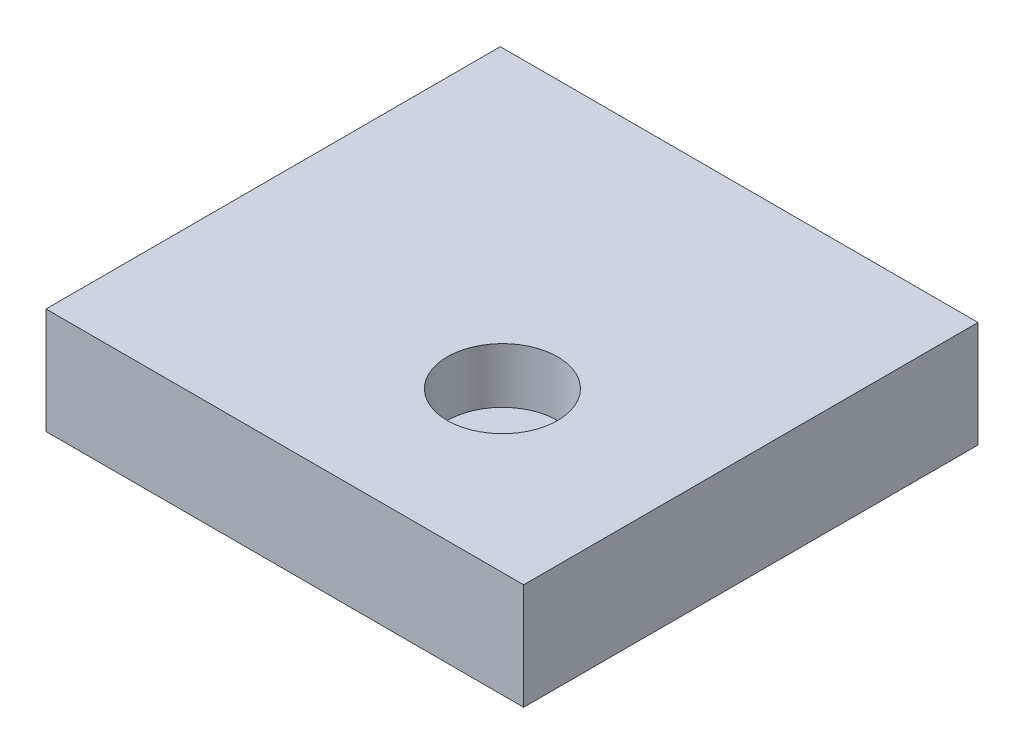
ISO-10303-21;
HEADER;
FILE_DESCRIPTION(('STEP AP214'),'2;1');
FILE_NAME('part.step','',(''),(''),'','','');
FILE_SCHEMA(('AUTOMOTIVE_DESIGN { 1 0 10303 214 1 1 1 1 }'));
ENDSEC;
DATA;
#1=APPLICATION_CONTEXT('core data for automotive mechanical design processes');
#2=APPLICATION_PROTOCOL_DEFINITION('international standard','automotive_design',2000,#1);
#3=PRODUCT_CONTEXT('',#1,'mechanical');
#4=PRODUCT('Part','Part','',(#3));
#5=PRODUCT_RELATED_PRODUCT_CATEGORY('part','',(#4));
#6=PRODUCT_DEFINITION_FORMATION('','',#4);
#7=PRODUCT_DEFINITION_CONTEXT('part definition',#1,'design');
#8=PRODUCT_DEFINITION('design','',#6,#7);
#9=PRODUCT_DEFINITION_SHAPE('','',#8);
#10=(LENGTH_UNIT() NAMED_UNIT(*) SI_UNIT(.MILLI.,.METRE.));
#11=(NAMED_UNIT(*) PLANE_ANGLE_UNIT() SI_UNIT($,.RADIAN.));
#12=(NAMED_UNIT(*) SI_UNIT($,.STERADIAN.) SOLID_ANGLE_UNIT());
#13=UNCERTAINTY_MEASURE_WITH_UNIT(LENGTH_MEASURE(1.E-05),#10,'distance_accuracy_value','');
#14=(GEOMETRIC_REPRESENTATION_CONTEXT(3) GLOBAL_UNCERTAINTY_ASSIGNED_CONTEXT((#13)) GLOBAL_UNIT_ASSIGNED_CONTEXT((#10,
#11,#12)) REPRESENTATION_CONTEXT('',''));
#15=CARTESIAN_POINT('',(0.,0.,0.));
#16=DIRECTION('',(0.,0.,1.));
#17=DIRECTION('',(1.,0.,0.));
#18=AXIS2_PLACEMENT_3D('',#15,#16,#17);
#19=CARTESIAN_POINT('',(-20.,5.,21.4));
#20=DIRECTION('',(0.,0.,-1.));
#21=DIRECTION('',(-1.,0.,0.));
#22=AXIS2_PLACEMENT_3D('',#19,#20,#21);
#23=PLANE('',#22);
#24=DIRECTION('',(1.,0.,0.));
#25=VECTOR('',#24,1.);
#26=CARTESIAN_POINT('',(-20.,0.,21.4));
#27=LINE('',#26,#25);
#28=CARTESIAN_POINT('',(-20.,0.,21.4));
#29=VERTEX_POINT('',#28);
#30=CARTESIAN_POINT('',(2.5,0.,21.4));
#31=VERTEX_POINT('',#30);
#32=EDGE_CURVE('E78',#29,#31,#27,.T.);
#33=ORIENTED_EDGE('',*,*,#32,.T.);
#34=DIRECTION('',(0.,-1.,0.));
#35=VECTOR('',#34,1.);
#36=CARTESIAN_POINT('',(2.5,0.,21.4));
#37=LINE('',#36,#35);
#38=CARTESIAN_POINT('',(2.5,5.,21.4));
#39=VERTEX_POINT('',#38);
#40=EDGE_CURVE('E81',#39,#31,#37,.T.);
#41=ORIENTED_EDGE('',*,*,#40,.F.);
#42=DIRECTION('',(1.,0.,0.));
#43=VECTOR('',#42,1.);
#44=CARTESIAN_POINT('',(-20.,5.,21.4));
#45=LINE('',#44,#43);
#46=CARTESIAN_POINT('',(-20.,5.,21.4));
#47=VERTEX_POINT('',#46);
#48=EDGE_CURVE('E65',#47,#39,#45,.T.);
#49=ORIENTED_EDGE('',*,*,#48,.F.);
#50=DIRECTION('',(0.,-1.,0.));
#51=VECTOR('',#50,1.);
#52=CARTESIAN_POINT('',(-20.,5.,21.4));
#53=LINE('',#52,#51);
#54=EDGE_CURVE('E45',#47,#29,#53,.T.);
#55=ORIENTED_EDGE('',*,*,#54,.T.);
#56=EDGE_LOOP('',(#33,#41,#49,#55));
#57=FACE_BOUND('',#56,.T.);
#58=ADVANCED_FACE('F37',(#57),#23,.F.);
#59=CARTESIAN_POINT('',(-20.,5.,0.));
#60=DIRECTION('',(0.,0.,-1.));
#61=DIRECTION('',(-1.,0.,0.));
#62=AXIS2_PLACEMENT_3D('',#59,#60,#61);
#63=PLANE('',#62);
#64=CARTESIAN_POINT('',(-5.,2.5,0.));
#65=DIRECTION('',(0.,0.,-1.));
#66=DIRECTION('',(-1.,0.,0.));
#67=AXIS2_PLACEMENT_3D('',#64,#65,#66);
#68=CIRCLE('',#67,0.85);
#69=CARTESIAN_POINT('',(-5.85,2.5,0.));
#70=VERTEX_POINT('',#69);
#71=EDGE_CURVE('E111',#70,#70,#68,.T.);
#72=ORIENTED_EDGE('',*,*,#71,.F.);
#73=EDGE_LOOP('',(#72));
#74=FACE_BOUND('',#73,.T.);
#75=CARTESIAN_POINT('',(-15.,2.5,0.));
#76=DIRECTION('',(0.,0.,-1.));
#77=DIRECTION('',(-1.,0.,0.));
#78=AXIS2_PLACEMENT_3D('',#75,#76,#77);
#79=CIRCLE('',#78,0.85);
#80=CARTESIAN_POINT('',(-15.85,2.5,0.));
#81=VERTEX_POINT('',#80);
#82=EDGE_CURVE('E114',#81,#81,#79,.T.);
#83=ORIENTED_EDGE('',*,*,#82,.F.);
#84=EDGE_LOOP('',(#83));
#85=FACE_BOUND('',#84,.T.);
#86=DIRECTION('',(1.,0.,0.));
#87=VECTOR('',#86,1.);
#88=CARTESIAN_POINT('',(-20.,0.,0.));
#89=LINE('',#88,#87);
#90=CARTESIAN_POINT('',(-20.,0.,0.));
#91=VERTEX_POINT('',#90);
#92=CARTESIAN_POINT('',(2.5,0.,0.));
#93=VERTEX_POINT('',#92);
#94=EDGE_CURVE('E84',#91,#93,#89,.T.);
#95=ORIENTED_EDGE('',*,*,#94,.F.);
#96=DIRECTION('',(0.,-1.,0.));
#97=VECTOR('',#96,1.);
#98=CARTESIAN_POINT('',(-20.,5.,0.));
#99=LINE('',#98,#97);
#100=CARTESIAN_POINT('',(-20.,5.,0.));
#101=VERTEX_POINT('',#100);
#102=EDGE_CURVE('E11',#101,#91,#99,.T.);
#103=ORIENTED_EDGE('',*,*,#102,.F.);
#104=DIRECTION('',(1.,0.,0.));
#105=VECTOR('',#104,1.);
#106=CARTESIAN_POINT('',(-20.,5.,0.));
#107=LINE('',#106,#105);
#108=CARTESIAN_POINT('',(2.5,5.,0.));
#109=VERTEX_POINT('',#108);
#110=EDGE_CURVE('E130',#101,#109,#107,.T.);
#111=ORIENTED_EDGE('',*,*,#110,.T.);
#112=DIRECTION('',(0.,1.,0.));
#113=VECTOR('',#112,1.);
#114=CARTESIAN_POINT('',(2.5,0.,0.));
#115=LINE('',#114,#113);
#116=EDGE_CURVE('E93',#93,#109,#115,.T.);
#117=ORIENTED_EDGE('',*,*,#116,.F.);
#118=EDGE_LOOP('',(#95,#103,#111,#117));
#119=FACE_BOUND('',#118,.T.);
#120=ADVANCED_FACE('F139',(#74,#85,#119),#63,.T.);
#121=CARTESIAN_POINT('',(-20.,5.,21.4));
#122=DIRECTION('',(-1.,0.,0.));
#123=DIRECTION('',(0.,0.,1.));
#124=AXIS2_PLACEMENT_3D('',#121,#122,#123);
#125=PLANE('',#124);
#126=CARTESIAN_POINT('',(-20.,2.5,16.4));
#127=DIRECTION('',(-1.,0.,0.));
#128=DIRECTION('',(0.,0.,1.));
#129=AXIS2_PLACEMENT_3D('',#126,#127,#128);
#130=CIRCLE('',#129,0.85);
#131=CARTESIAN_POINT('',(-20.,2.5,17.25));
#132=VERTEX_POINT('',#131);
#133=EDGE_CURVE('E121',#132,#132,#130,.T.);
#134=ORIENTED_EDGE('',*,*,#133,.F.);
#135=EDGE_LOOP('',(#134));
#136=FACE_BOUND('',#135,.T.);
#137=CARTESIAN_POINT('',(-20.,2.5,5.));
#138=DIRECTION('',(-1.,0.,0.));
#139=DIRECTION('',(0.,0.,1.));
#140=AXIS2_PLACEMENT_3D('',#137,#138,#139);
#141=CIRCLE('',#140,0.85);
#142=CARTESIAN_POINT('',(-20.,2.5,5.85));
#143=VERTEX_POINT('',#142);
#144=EDGE_CURVE('E124',#143,#143,#141,.T.);
#145=ORIENTED_EDGE('',*,*,#144,.F.);
#146=EDGE_LOOP('',(#145));
#147=FACE_BOUND('',#146,.T.);
#148=DIRECTION('',(0.,0.,-1.));
#149=VECTOR('',#148,1.);
#150=CARTESIAN_POINT('',(-20.,0.,21.4));
#151=LINE('',#150,#149);
#152=EDGE_CURVE('E131',#29,#91,#151,.T.);
#153=ORIENTED_EDGE('',*,*,#152,.F.);
#154=ORIENTED_EDGE('',*,*,#54,.F.);
#155=DIRECTION('',(0.,0.,-1.));
#156=VECTOR('',#155,1.);
#157=CARTESIAN_POINT('',(-20.,5.,21.4));
#158=LINE('',#157,#156);
#159=EDGE_CURVE('E133',#47,#101,#158,.T.);
#160=ORIENTED_EDGE('',*,*,#159,.T.);
#161=ORIENTED_EDGE('',*,*,#102,.T.);
#162=EDGE_LOOP('',(#153,#154,#160,#161));
#163=FACE_BOUND('',#162,.T.);
#164=ADVANCED_FACE('F136',(#136,#147,#163),#125,.T.);
#165=CARTESIAN_POINT('',(0.,5.,0.));
#166=DIRECTION('',(0.,1.,0.));
#167=DIRECTION('',(0.,0.,1.));
#168=AXIS2_PLACEMENT_3D('',#165,#166,#167);
#169=PLANE('',#168);
#170=CARTESIAN_POINT('',(-6.00000000000001,5.,13.9));
#171=DIRECTION('',(0.,1.,0.));
#172=DIRECTION('',(0.,0.,1.));
#173=AXIS2_PLACEMENT_3D('',#170,#171,#172);
#174=CIRCLE('',#173,2.6);
#175=CARTESIAN_POINT('',(-6.00000000000001,5.,16.5));
#176=VERTEX_POINT('',#175);
#177=EDGE_CURVE('E100',#176,#176,#174,.T.);
#178=ORIENTED_EDGE('',*,*,#177,.F.);
#179=EDGE_LOOP('',(#178));
#180=FACE_BOUND('',#179,.T.);
#181=ORIENTED_EDGE('',*,*,#48,.T.);
#182=DIRECTION('',(0.,0.,1.));
#183=VECTOR('',#182,1.);
#184=CARTESIAN_POINT('',(2.5,5.,21.4));
#185=LINE('',#184,#183);
#186=EDGE_CURVE('E96',#109,#39,#185,.T.);
#187=ORIENTED_EDGE('',*,*,#186,.F.);
#188=ORIENTED_EDGE('',*,*,#110,.F.);
#189=ORIENTED_EDGE('',*,*,#159,.F.);
#190=EDGE_LOOP('',(#181,#187,#188,#189));
#191=FACE_BOUND('',#190,.T.);
#192=ADVANCED_FACE('F138',(#180,#191),#169,.T.);
#193=CARTESIAN_POINT('',(0.,0.,0.));
#194=DIRECTION('',(0.,1.,0.));
#195=DIRECTION('',(0.,0.,1.));
#196=AXIS2_PLACEMENT_3D('',#193,#194,#195);
#197=PLANE('',#196);
#198=ORIENTED_EDGE('',*,*,#32,.F.);
#199=ORIENTED_EDGE('',*,*,#152,.T.);
#200=ORIENTED_EDGE('',*,*,#94,.T.);
#201=DIRECTION('',(0.,0.,-1.));
#202=VECTOR('',#201,1.);
#203=CARTESIAN_POINT('',(2.5,0.,21.4));
#204=LINE('',#203,#202);
#205=EDGE_CURVE('E88',#31,#93,#204,.T.);
#206=ORIENTED_EDGE('',*,*,#205,.F.);
#207=EDGE_LOOP('',(#198,#199,#200,#206));
#208=FACE_BOUND('',#207,.T.);
#209=ADVANCED_FACE('F89',(#208),#197,.F.);
#210=CARTESIAN_POINT('',(-16.,2.5,5.));
#211=DIRECTION('',(-1.,0.,0.));
#212=DIRECTION('',(0.,0.,1.));
#213=AXIS2_PLACEMENT_3D('',#210,#211,#212);
#214=CYLINDRICAL_SURFACE('',#213,0.85);
#215=CARTESIAN_POINT('',(-16.,2.5,5.));
#216=DIRECTION('',(-1.,0.,0.));
#217=DIRECTION('',(0.,0.,1.));
#218=AXIS2_PLACEMENT_3D('',#215,#216,#217);
#219=CIRCLE('',#218,0.85);
#220=CARTESIAN_POINT('',(-16.,2.5,5.85));
#221=VERTEX_POINT('',#220);
#222=EDGE_CURVE('E110',#221,#221,#219,.T.);
#223=ORIENTED_EDGE('',*,*,#222,.F.);
#224=EDGE_LOOP('',(#223));
#225=FACE_BOUND('',#224,.T.);
#226=ORIENTED_EDGE('',*,*,#144,.T.);
#227=EDGE_LOOP('',(#226));
#228=FACE_BOUND('',#227,.T.);
#229=ADVANCED_FACE('F179',(#225,#228),#214,.F.);
#230=CARTESIAN_POINT('',(-16.,2.5,5.));
#231=DIRECTION('',(-1.,0.,0.));
#232=DIRECTION('',(0.,0.,1.));
#233=AXIS2_PLACEMENT_3D('',#230,#231,#232);
#234=PLANE('',#233);
#235=ORIENTED_EDGE('',*,*,#222,.T.);
#236=EDGE_LOOP('',(#235));
#237=FACE_BOUND('',#236,.T.);
#238=ADVANCED_FACE('F183',(#237),#234,.T.);
#239=CARTESIAN_POINT('',(-16.,2.5,16.4));
#240=DIRECTION('',(-1.,0.,0.));
#241=DIRECTION('',(0.,0.,1.));
#242=AXIS2_PLACEMENT_3D('',#239,#240,#241);
#243=CYLINDRICAL_SURFACE('',#242,0.85);
#244=CARTESIAN_POINT('',(-16.,2.5,16.4));
#245=DIRECTION('',(-1.,0.,0.));
#246=DIRECTION('',(0.,0.,1.));
#247=AXIS2_PLACEMENT_3D('',#244,#245,#246);
#248=CIRCLE('',#247,0.85);
#249=CARTESIAN_POINT('',(-16.,2.5,17.25));
#250=VERTEX_POINT('',#249);
#251=EDGE_CURVE('E85',#250,#250,#248,.T.);
#252=ORIENTED_EDGE('',*,*,#251,.F.);
#253=EDGE_LOOP('',(#252));
#254=FACE_BOUND('',#253,.T.);
#255=ORIENTED_EDGE('',*,*,#133,.T.);
#256=EDGE_LOOP('',(#255));
#257=FACE_BOUND('',#256,.T.);
#258=ADVANCED_FACE('F191',(#254,#257),#243,.F.);
#259=CARTESIAN_POINT('',(-16.,2.5,16.4));
#260=DIRECTION('',(-1.,0.,0.));
#261=DIRECTION('',(0.,0.,1.));
#262=AXIS2_PLACEMENT_3D('',#259,#260,#261);
#263=PLANE('',#262);
#264=ORIENTED_EDGE('',*,*,#251,.T.);
#265=EDGE_LOOP('',(#264));
#266=FACE_BOUND('',#265,.T.);
#267=ADVANCED_FACE('F199',(#266),#263,.T.);
#268=CARTESIAN_POINT('',(-15.,2.5,4.));
#269=DIRECTION('',(0.,0.,-1.));
#270=DIRECTION('',(-1.,0.,0.));
#271=AXIS2_PLACEMENT_3D('',#268,#269,#270);
#272=CYLINDRICAL_SURFACE('',#271,0.85);
#273=CARTESIAN_POINT('',(-15.,2.5,4.));
#274=DIRECTION('',(0.,0.,-1.));
#275=DIRECTION('',(-1.,0.,0.));
#276=AXIS2_PLACEMENT_3D('',#273,#274,#275);
#277=CIRCLE('',#276,0.85);
#278=CARTESIAN_POINT('',(-15.85,2.5,4.));
#279=VERTEX_POINT('',#278);
#280=EDGE_CURVE('E106',#279,#279,#277,.T.);
#281=ORIENTED_EDGE('',*,*,#280,.F.);
#282=EDGE_LOOP('',(#281));
#283=FACE_BOUND('',#282,.T.);
#284=ORIENTED_EDGE('',*,*,#82,.T.);
#285=EDGE_LOOP('',(#284));
#286=FACE_BOUND('',#285,.T.);
#287=ADVANCED_FACE('F207',(#283,#286),#272,.F.);
#288=CARTESIAN_POINT('',(-15.,2.5,4.));
#289=DIRECTION('',(0.,0.,-1.));
#290=DIRECTION('',(-1.,0.,0.));
#291=AXIS2_PLACEMENT_3D('',#288,#289,#290);
#292=PLANE('',#291);
#293=ORIENTED_EDGE('',*,*,#280,.T.);
#294=EDGE_LOOP('',(#293));
#295=FACE_BOUND('',#294,.T.);
#296=ADVANCED_FACE('F215',(#295),#292,.T.);
#297=CARTESIAN_POINT('',(-5.,2.5,4.));
#298=DIRECTION('',(0.,0.,-1.));
#299=DIRECTION('',(-1.,0.,0.));
#300=AXIS2_PLACEMENT_3D('',#297,#298,#299);
#301=CYLINDRICAL_SURFACE('',#300,0.85);
#302=CARTESIAN_POINT('',(-5.,2.5,4.));
#303=DIRECTION('',(0.,0.,-1.));
#304=DIRECTION('',(-1.,0.,0.));
#305=AXIS2_PLACEMENT_3D('',#302,#303,#304);
#306=CIRCLE('',#305,0.85);
#307=CARTESIAN_POINT('',(-5.85,2.5,4.));
#308=VERTEX_POINT('',#307);
#309=EDGE_CURVE('E107',#308,#308,#306,.T.);
#310=ORIENTED_EDGE('',*,*,#309,.F.);
#311=EDGE_LOOP('',(#310));
#312=FACE_BOUND('',#311,.T.);
#313=ORIENTED_EDGE('',*,*,#71,.T.);
#314=EDGE_LOOP('',(#313));
#315=FACE_BOUND('',#314,.T.);
#316=ADVANCED_FACE('F223',(#312,#315),#301,.F.);
#317=CARTESIAN_POINT('',(-5.,2.5,4.));
#318=DIRECTION('',(0.,0.,-1.));
#319=DIRECTION('',(-1.,0.,0.));
#320=AXIS2_PLACEMENT_3D('',#317,#318,#319);
#321=PLANE('',#320);
#322=ORIENTED_EDGE('',*,*,#309,.T.);
#323=EDGE_LOOP('',(#322));
#324=FACE_BOUND('',#323,.T.);
#325=ADVANCED_FACE('F231',(#324),#321,.T.);
#326=CARTESIAN_POINT('',(2.5,0.,0.));
#327=DIRECTION('',(-1.,0.,0.));
#328=DIRECTION('',(0.,0.,1.));
#329=AXIS2_PLACEMENT_3D('',#326,#327,#328);
#330=PLANE('',#329);
#331=ORIENTED_EDGE('',*,*,#40,.T.);
#332=ORIENTED_EDGE('',*,*,#205,.T.);
#333=ORIENTED_EDGE('',*,*,#116,.T.);
#334=ORIENTED_EDGE('',*,*,#186,.T.);
#335=EDGE_LOOP('',(#331,#332,#333,#334));
#336=FACE_BOUND('',#335,.T.);
#337=ADVANCED_FACE('F95',(#336),#330,.F.);
#338=CARTESIAN_POINT('',(-6.00000000000001,2.4,13.9));
#339=DIRECTION('',(0.,1.,0.));
#340=DIRECTION('',(0.,0.,1.));
#341=AXIS2_PLACEMENT_3D('',#338,#339,#340);
#342=CYLINDRICAL_SURFACE('',#341,2.6);
#343=CARTESIAN_POINT('',(-6.00000000000001,2.4,13.9));
#344=DIRECTION('',(0.,1.,0.));
#345=DIRECTION('',(0.,0.,1.));
#346=AXIS2_PLACEMENT_3D('',#343,#344,#345);
#347=CIRCLE('',#346,2.6);
#348=CARTESIAN_POINT('',(-6.00000000000001,2.4,16.5));
#349=VERTEX_POINT('',#348);
#350=EDGE_CURVE('E97',#349,#349,#347,.T.);
#351=ORIENTED_EDGE('',*,*,#350,.F.);
#352=EDGE_LOOP('',(#351));
#353=FACE_BOUND('',#352,.T.);
#354=ORIENTED_EDGE('',*,*,#177,.T.);
#355=EDGE_LOOP('',(#354));
#356=FACE_BOUND('',#355,.T.);
#357=ADVANCED_FACE('F244',(#353,#356),#342,.F.);
#358=CARTESIAN_POINT('',(-6.00000000000001,2.4,13.9));
#359=DIRECTION('',(0.,1.,0.));
#360=DIRECTION('',(0.,0.,1.));
#361=AXIS2_PLACEMENT_3D('',#358,#359,#360);
#362=PLANE('',#361);
#363=ORIENTED_EDGE('',*,*,#350,.T.);
#364=EDGE_LOOP('',(#363));
#365=FACE_BOUND('',#364,.T.);
#366=ADVANCED_FACE('F250',(#365),#362,.T.);
#367=CLOSED_SHELL('',(#58,#120,#164,#192,#209,#229,#238,#258,#267,#287,#296,#316,#325,#337,#357,#366));
#368=MANIFOLD_SOLID_BREP('B2',#367);
#369=ADVANCED_BREP_SHAPE_REPRESENTATION('',(#18,#368),#14);
#370=SHAPE_DEFINITION_REPRESENTATION(#9,#369);
ENDSEC;
END-ISO-10303-21;
